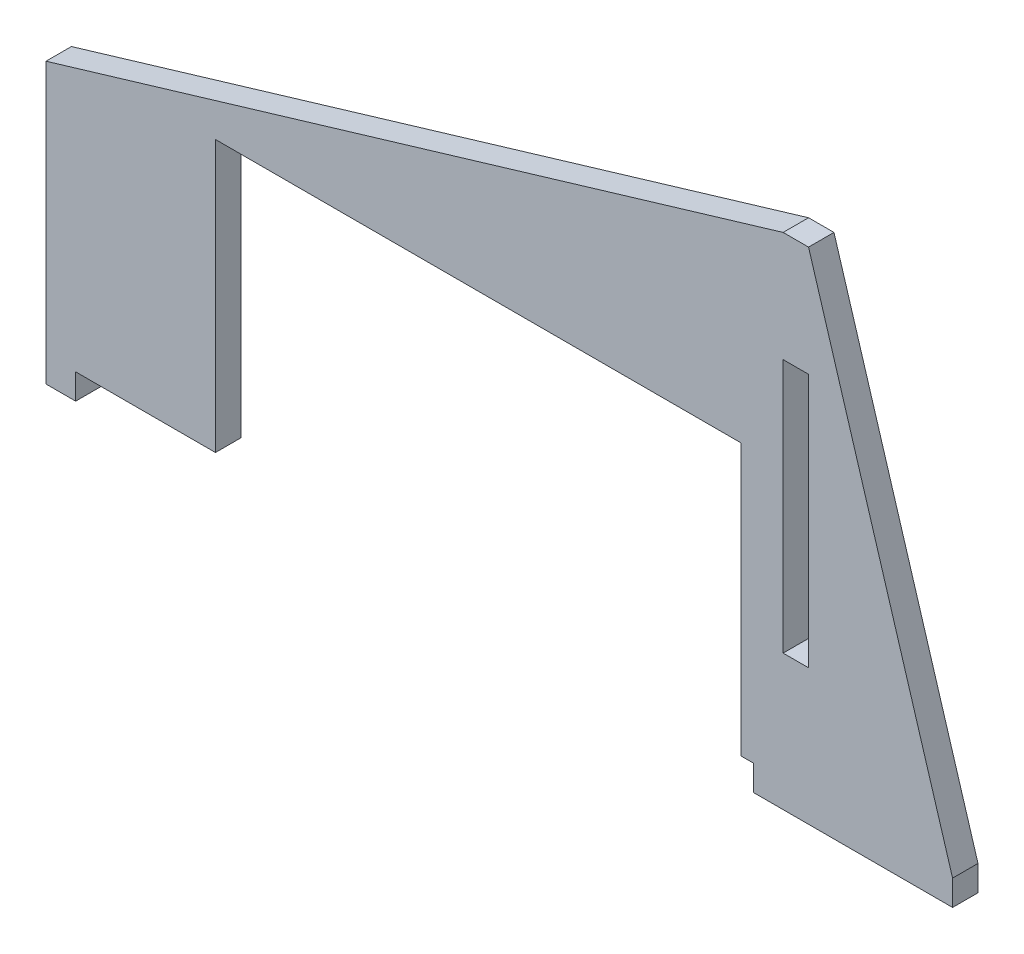
ISO-10303-21;
HEADER;
FILE_DESCRIPTION(('STEP AP214'),'2;1');
FILE_NAME('part.step','',(''),(''),'','','');
FILE_SCHEMA(('AUTOMOTIVE_DESIGN { 1 0 10303 214 1 1 1 1 }'));
ENDSEC;
DATA;
#1=APPLICATION_CONTEXT('core data for automotive mechanical design processes');
#2=APPLICATION_PROTOCOL_DEFINITION('international standard','automotive_design',2000,#1);
#3=PRODUCT_CONTEXT('',#1,'mechanical');
#4=PRODUCT('Part','Part','',(#3));
#5=PRODUCT_RELATED_PRODUCT_CATEGORY('part','',(#4));
#6=PRODUCT_DEFINITION_FORMATION('','',#4);
#7=PRODUCT_DEFINITION_CONTEXT('part definition',#1,'design');
#8=PRODUCT_DEFINITION('design','',#6,#7);
#9=PRODUCT_DEFINITION_SHAPE('','',#8);
#10=(LENGTH_UNIT() NAMED_UNIT(*) SI_UNIT(.MILLI.,.METRE.));
#11=(NAMED_UNIT(*) PLANE_ANGLE_UNIT() SI_UNIT($,.RADIAN.));
#12=(NAMED_UNIT(*) SI_UNIT($,.STERADIAN.) SOLID_ANGLE_UNIT());
#13=UNCERTAINTY_MEASURE_WITH_UNIT(LENGTH_MEASURE(1.E-05),#10,'distance_accuracy_value','');
#14=(GEOMETRIC_REPRESENTATION_CONTEXT(3) GLOBAL_UNCERTAINTY_ASSIGNED_CONTEXT((#13)) GLOBAL_UNIT_ASSIGNED_CONTEXT((#10,
#11,#12)) REPRESENTATION_CONTEXT('',''));
#15=CARTESIAN_POINT('',(0.,0.,0.));
#16=DIRECTION('',(0.,0.,1.));
#17=DIRECTION('',(1.,0.,0.));
#18=AXIS2_PLACEMENT_3D('',#15,#16,#17);
#19=CARTESIAN_POINT('',(0.,0.,3.));
#20=DIRECTION('',(0.,0.,-1.));
#21=DIRECTION('',(-1.,0.,0.));
#22=AXIS2_PLACEMENT_3D('',#19,#20,#21);
#23=PLANE('',#22);
#24=DIRECTION('',(0.,-1.,0.));
#25=VECTOR('',#24,1.);
#26=CARTESIAN_POINT('',(-90.,33.,3.));
#27=LINE('',#26,#25);
#28=CARTESIAN_POINT('',(-90.,33.,3.));
#29=VERTEX_POINT('',#28);
#30=CARTESIAN_POINT('',(-90.,0.,3.));
#31=VERTEX_POINT('',#30);
#32=EDGE_CURVE('E194',#29,#31,#27,.T.);
#33=ORIENTED_EDGE('',*,*,#32,.T.);
#34=DIRECTION('',(1.,-1.16063243671944E-11,0.));
#35=VECTOR('',#34,1.);
#36=CARTESIAN_POINT('',(-90.,0.,3.));
#37=LINE('',#36,#35);
#38=CARTESIAN_POINT('',(-86.5,-4.06256047321326E-11,3.));
#39=VERTEX_POINT('',#38);
#40=EDGE_CURVE('E197',#31,#39,#37,.T.);
#41=ORIENTED_EDGE('',*,*,#40,.T.);
#42=DIRECTION('',(0.,1.,0.));
#43=VECTOR('',#42,1.);
#44=CARTESIAN_POINT('',(-86.5,2.99999999995937,3.));
#45=LINE('',#44,#43);
#46=CARTESIAN_POINT('',(-86.5,2.99999999995937,3.));
#47=VERTEX_POINT('',#46);
#48=EDGE_CURVE('E200',#39,#47,#45,.T.);
#49=ORIENTED_EDGE('',*,*,#48,.T.);
#50=DIRECTION('',(1.,0.,0.));
#51=VECTOR('',#50,1.);
#52=CARTESIAN_POINT('',(-70.,2.99999999995942,3.));
#53=LINE('',#52,#51);
#54=CARTESIAN_POINT('',(-70.,2.99999999995942,3.));
#55=VERTEX_POINT('',#54);
#56=EDGE_CURVE('E202',#47,#55,#53,.T.);
#57=ORIENTED_EDGE('',*,*,#56,.T.);
#58=DIRECTION('',(0.,1.,0.));
#59=VECTOR('',#58,1.);
#60=CARTESIAN_POINT('',(-70.,2.99999999995942,3.));
#61=LINE('',#60,#59);
#62=CARTESIAN_POINT('',(-70.,34.9999999999594,3.));
#63=VERTEX_POINT('',#62);
#64=EDGE_CURVE('E204',#55,#63,#61,.T.);
#65=ORIENTED_EDGE('',*,*,#64,.T.);
#66=DIRECTION('',(1.,0.,0.));
#67=VECTOR('',#66,1.);
#68=CARTESIAN_POINT('',(-70.,34.9999999999594,3.));
#69=LINE('',#68,#67);
#70=CARTESIAN_POINT('',(-7.99999999999996,34.9999999999594,3.));
#71=VERTEX_POINT('',#70);
#72=EDGE_CURVE('E206',#63,#71,#69,.T.);
#73=ORIENTED_EDGE('',*,*,#72,.T.);
#74=DIRECTION('',(0.,-1.,0.));
#75=VECTOR('',#74,1.);
#76=CARTESIAN_POINT('',(-7.99999999999996,2.99999999995956,3.));
#77=LINE('',#76,#75);
#78=CARTESIAN_POINT('',(-7.99999999999996,2.99999999995956,3.));
#79=VERTEX_POINT('',#78);
#80=EDGE_CURVE('E208',#71,#79,#77,.T.);
#81=ORIENTED_EDGE('',*,*,#80,.T.);
#82=DIRECTION('',(1.,0.,0.));
#83=VECTOR('',#82,1.);
#84=CARTESIAN_POINT('',(-6.49999999999997,2.99999999995956,3.));
#85=LINE('',#84,#83);
#86=CARTESIAN_POINT('',(-6.49999999999997,2.99999999995956,3.));
#87=VERTEX_POINT('',#86);
#88=EDGE_CURVE('E210',#79,#87,#85,.T.);
#89=ORIENTED_EDGE('',*,*,#88,.T.);
#90=DIRECTION('',(0.,-1.,0.));
#91=VECTOR('',#90,1.);
#92=CARTESIAN_POINT('',(-6.49999999999996,-4.04405675613617E-11,3.));
#93=LINE('',#92,#91);
#94=CARTESIAN_POINT('',(-6.49999999999996,-4.04405675613617E-11,3.));
#95=VERTEX_POINT('',#94);
#96=EDGE_CURVE('E212',#87,#95,#93,.T.);
#97=ORIENTED_EDGE('',*,*,#96,.T.);
#98=DIRECTION('',(1.,1.7208752153771E-12,0.));
#99=VECTOR('',#98,1.);
#100=CARTESIAN_POINT('',(-6.49999999999996,-4.04405675613617E-11,3.));
#101=LINE('',#100,#99);
#102=CARTESIAN_POINT('',(17.,0.,3.));
#103=VERTEX_POINT('',#102);
#104=EDGE_CURVE('E214',#95,#103,#101,.T.);
#105=ORIENTED_EDGE('',*,*,#104,.T.);
#106=DIRECTION('',(0.,1.,0.));
#107=VECTOR('',#106,1.);
#108=CARTESIAN_POINT('',(17.,0.,3.));
#109=LINE('',#108,#107);
#110=CARTESIAN_POINT('',(17.,3.,3.));
#111=VERTEX_POINT('',#110);
#112=EDGE_CURVE('E216',#103,#111,#109,.T.);
#113=ORIENTED_EDGE('',*,*,#112,.T.);
#114=DIRECTION('',(-0.290481603623537,0.956880576642821,0.));
#115=VECTOR('',#114,1.);
#116=CARTESIAN_POINT('',(17.,3.,3.));
#117=LINE('',#116,#115);
#118=CARTESIAN_POINT('',(0.,59.000000000034,3.));
#119=VERTEX_POINT('',#118);
#120=EDGE_CURVE('E218',#111,#119,#117,.T.);
#121=ORIENTED_EDGE('',*,*,#120,.T.);
#122=DIRECTION('',(-1.,0.,0.));
#123=VECTOR('',#122,1.);
#124=CARTESIAN_POINT('',(0.,59.000000000034,3.));
#125=LINE('',#124,#123);
#126=CARTESIAN_POINT('',(-3.,59.000000000034,3.));
#127=VERTEX_POINT('',#126);
#128=EDGE_CURVE('E220',#119,#127,#125,.T.);
#129=ORIENTED_EDGE('',*,*,#128,.T.);
#130=DIRECTION('',(-0.958128861743707,-0.286337360981252,0.));
#131=VECTOR('',#130,1.);
#132=CARTESIAN_POINT('',(-3.,59.000000000034,3.));
#133=LINE('',#132,#131);
#134=EDGE_CURVE('E222',#127,#29,#133,.T.);
#135=ORIENTED_EDGE('',*,*,#134,.T.);
#136=EDGE_LOOP('',(#33,#41,#49,#57,#65,#73,#81,#89,#97,#105,#113,#121,#129,#135));
#137=FACE_BOUND('',#136,.T.);
#138=DIRECTION('',(-1.,0.,0.));
#139=VECTOR('',#138,1.);
#140=CARTESIAN_POINT('',(0.,45.9999999999955,3.));
#141=LINE('',#140,#139);
#142=CARTESIAN_POINT('',(0.,45.9999999999955,3.));
#143=VERTEX_POINT('',#142);
#144=CARTESIAN_POINT('',(-3.,45.9999999999955,3.));
#145=VERTEX_POINT('',#144);
#146=EDGE_CURVE('E158',#143,#145,#141,.T.);
#147=ORIENTED_EDGE('',*,*,#146,.F.);
#148=DIRECTION('',(0.,1.,0.));
#149=VECTOR('',#148,1.);
#150=CARTESIAN_POINT('',(0.,15.9999999999955,3.));
#151=LINE('',#150,#149);
#152=CARTESIAN_POINT('',(0.,15.9999999999955,3.));
#153=VERTEX_POINT('',#152);
#154=EDGE_CURVE('E180',#153,#143,#151,.T.);
#155=ORIENTED_EDGE('',*,*,#154,.F.);
#156=DIRECTION('',(1.,0.,0.));
#157=VECTOR('',#156,1.);
#158=CARTESIAN_POINT('',(-3.,15.9999999999955,3.));
#159=LINE('',#158,#157);
#160=CARTESIAN_POINT('',(-3.,15.9999999999955,3.));
#161=VERTEX_POINT('',#160);
#162=EDGE_CURVE('E178',#161,#153,#159,.T.);
#163=ORIENTED_EDGE('',*,*,#162,.F.);
#164=DIRECTION('',(0.,-1.,0.));
#165=VECTOR('',#164,1.);
#166=CARTESIAN_POINT('',(-3.,45.9999999999955,3.));
#167=LINE('',#166,#165);
#168=EDGE_CURVE('E166',#145,#161,#167,.T.);
#169=ORIENTED_EDGE('',*,*,#168,.F.);
#170=EDGE_LOOP('',(#147,#155,#163,#169));
#171=FACE_BOUND('',#170,.T.);
#172=ADVANCED_FACE('F33',(#137,#171),#23,.F.);
#173=CARTESIAN_POINT('',(0.,0.,0.));
#174=DIRECTION('',(0.,0.,-1.));
#175=DIRECTION('',(-1.,0.,0.));
#176=AXIS2_PLACEMENT_3D('',#173,#174,#175);
#177=PLANE('',#176);
#178=DIRECTION('',(0.,-1.,0.));
#179=VECTOR('',#178,1.);
#180=CARTESIAN_POINT('',(-90.,33.,0.));
#181=LINE('',#180,#179);
#182=CARTESIAN_POINT('',(-90.,33.,0.));
#183=VERTEX_POINT('',#182);
#184=CARTESIAN_POINT('',(-90.,0.,0.));
#185=VERTEX_POINT('',#184);
#186=EDGE_CURVE('E174',#183,#185,#181,.T.);
#187=ORIENTED_EDGE('',*,*,#186,.F.);
#188=DIRECTION('',(-0.958128861743707,-0.286337360981252,0.));
#189=VECTOR('',#188,1.);
#190=CARTESIAN_POINT('',(-3.,59.000000000034,0.));
#191=LINE('',#190,#189);
#192=CARTESIAN_POINT('',(-3.,59.000000000034,0.));
#193=VERTEX_POINT('',#192);
#194=EDGE_CURVE('E198',#193,#183,#191,.T.);
#195=ORIENTED_EDGE('',*,*,#194,.F.);
#196=DIRECTION('',(-1.,0.,0.));
#197=VECTOR('',#196,1.);
#198=CARTESIAN_POINT('',(0.,59.000000000034,0.));
#199=LINE('',#198,#197);
#200=CARTESIAN_POINT('',(0.,59.000000000034,0.));
#201=VERTEX_POINT('',#200);
#202=EDGE_CURVE('E249',#201,#193,#199,.T.);
#203=ORIENTED_EDGE('',*,*,#202,.F.);
#204=DIRECTION('',(-0.290481603623537,0.956880576642821,0.));
#205=VECTOR('',#204,1.);
#206=CARTESIAN_POINT('',(17.,3.,0.));
#207=LINE('',#206,#205);
#208=CARTESIAN_POINT('',(17.,3.,0.));
#209=VERTEX_POINT('',#208);
#210=EDGE_CURVE('E247',#209,#201,#207,.T.);
#211=ORIENTED_EDGE('',*,*,#210,.F.);
#212=DIRECTION('',(0.,1.,0.));
#213=VECTOR('',#212,1.);
#214=CARTESIAN_POINT('',(17.,0.,0.));
#215=LINE('',#214,#213);
#216=CARTESIAN_POINT('',(17.,0.,0.));
#217=VERTEX_POINT('',#216);
#218=EDGE_CURVE('E245',#217,#209,#215,.T.);
#219=ORIENTED_EDGE('',*,*,#218,.F.);
#220=DIRECTION('',(1.,1.7208752153771E-12,0.));
#221=VECTOR('',#220,1.);
#222=CARTESIAN_POINT('',(-6.49999999999996,-4.04405675613617E-11,0.));
#223=LINE('',#222,#221);
#224=CARTESIAN_POINT('',(-6.49999999999996,-4.04405675613617E-11,0.));
#225=VERTEX_POINT('',#224);
#226=EDGE_CURVE('E243',#225,#217,#223,.T.);
#227=ORIENTED_EDGE('',*,*,#226,.F.);
#228=DIRECTION('',(0.,-1.,0.));
#229=VECTOR('',#228,1.);
#230=CARTESIAN_POINT('',(-6.49999999999996,-4.04405675613617E-11,0.));
#231=LINE('',#230,#229);
#232=CARTESIAN_POINT('',(-6.49999999999997,2.99999999995956,0.));
#233=VERTEX_POINT('',#232);
#234=EDGE_CURVE('E241',#233,#225,#231,.T.);
#235=ORIENTED_EDGE('',*,*,#234,.F.);
#236=DIRECTION('',(1.,0.,0.));
#237=VECTOR('',#236,1.);
#238=CARTESIAN_POINT('',(-6.49999999999997,2.99999999995956,0.));
#239=LINE('',#238,#237);
#240=CARTESIAN_POINT('',(-7.99999999999996,2.99999999995956,0.));
#241=VERTEX_POINT('',#240);
#242=EDGE_CURVE('E239',#241,#233,#239,.T.);
#243=ORIENTED_EDGE('',*,*,#242,.F.);
#244=DIRECTION('',(0.,-1.,0.));
#245=VECTOR('',#244,1.);
#246=CARTESIAN_POINT('',(-7.99999999999996,2.99999999995956,0.));
#247=LINE('',#246,#245);
#248=CARTESIAN_POINT('',(-7.99999999999996,34.9999999999594,0.));
#249=VERTEX_POINT('',#248);
#250=EDGE_CURVE('E237',#249,#241,#247,.T.);
#251=ORIENTED_EDGE('',*,*,#250,.F.);
#252=DIRECTION('',(1.,0.,0.));
#253=VECTOR('',#252,1.);
#254=CARTESIAN_POINT('',(-70.,34.9999999999594,0.));
#255=LINE('',#254,#253);
#256=CARTESIAN_POINT('',(-70.,34.9999999999594,0.));
#257=VERTEX_POINT('',#256);
#258=EDGE_CURVE('E235',#257,#249,#255,.T.);
#259=ORIENTED_EDGE('',*,*,#258,.F.);
#260=DIRECTION('',(0.,1.,0.));
#261=VECTOR('',#260,1.);
#262=CARTESIAN_POINT('',(-70.,2.99999999995942,0.));
#263=LINE('',#262,#261);
#264=CARTESIAN_POINT('',(-70.,2.99999999995942,0.));
#265=VERTEX_POINT('',#264);
#266=EDGE_CURVE('E233',#265,#257,#263,.T.);
#267=ORIENTED_EDGE('',*,*,#266,.F.);
#268=DIRECTION('',(1.,0.,0.));
#269=VECTOR('',#268,1.);
#270=CARTESIAN_POINT('',(-70.,2.99999999995942,0.));
#271=LINE('',#270,#269);
#272=CARTESIAN_POINT('',(-86.5,2.99999999995937,0.));
#273=VERTEX_POINT('',#272);
#274=EDGE_CURVE('E231',#273,#265,#271,.T.);
#275=ORIENTED_EDGE('',*,*,#274,.F.);
#276=DIRECTION('',(0.,1.,0.));
#277=VECTOR('',#276,1.);
#278=CARTESIAN_POINT('',(-86.5,2.99999999995937,0.));
#279=LINE('',#278,#277);
#280=CARTESIAN_POINT('',(-86.5,-4.06256047321326E-11,0.));
#281=VERTEX_POINT('',#280);
#282=EDGE_CURVE('E229',#281,#273,#279,.T.);
#283=ORIENTED_EDGE('',*,*,#282,.F.);
#284=DIRECTION('',(1.,-1.16063243671944E-11,0.));
#285=VECTOR('',#284,1.);
#286=CARTESIAN_POINT('',(-90.,0.,0.));
#287=LINE('',#286,#285);
#288=EDGE_CURVE('E227',#185,#281,#287,.T.);
#289=ORIENTED_EDGE('',*,*,#288,.F.);
#290=EDGE_LOOP('',(#187,#195,#203,#211,#219,#227,#235,#243,#251,#259,#267,#275,#283,#289));
#291=FACE_BOUND('',#290,.T.);
#292=DIRECTION('',(0.,1.,0.));
#293=VECTOR('',#292,1.);
#294=CARTESIAN_POINT('',(0.,15.9999999999955,0.));
#295=LINE('',#294,#293);
#296=CARTESIAN_POINT('',(0.,15.9999999999955,0.));
#297=VERTEX_POINT('',#296);
#298=CARTESIAN_POINT('',(0.,45.9999999999955,0.));
#299=VERTEX_POINT('',#298);
#300=EDGE_CURVE('E167',#297,#299,#295,.T.);
#301=ORIENTED_EDGE('',*,*,#300,.T.);
#302=DIRECTION('',(-1.,0.,0.));
#303=VECTOR('',#302,1.);
#304=CARTESIAN_POINT('',(0.,45.9999999999955,0.));
#305=LINE('',#304,#303);
#306=CARTESIAN_POINT('',(-3.,45.9999999999955,0.));
#307=VERTEX_POINT('',#306);
#308=EDGE_CURVE('E56',#299,#307,#305,.T.);
#309=ORIENTED_EDGE('',*,*,#308,.T.);
#310=DIRECTION('',(0.,-1.,0.));
#311=VECTOR('',#310,1.);
#312=CARTESIAN_POINT('',(-3.,45.9999999999955,0.));
#313=LINE('',#312,#311);
#314=CARTESIAN_POINT('',(-3.,15.9999999999955,0.));
#315=VERTEX_POINT('',#314);
#316=EDGE_CURVE('E173',#307,#315,#313,.T.);
#317=ORIENTED_EDGE('',*,*,#316,.T.);
#318=DIRECTION('',(1.,0.,0.));
#319=VECTOR('',#318,1.);
#320=CARTESIAN_POINT('',(-3.,15.9999999999955,0.));
#321=LINE('',#320,#319);
#322=EDGE_CURVE('E186',#315,#297,#321,.T.);
#323=ORIENTED_EDGE('',*,*,#322,.T.);
#324=EDGE_LOOP('',(#301,#309,#317,#323));
#325=FACE_BOUND('',#324,.T.);
#326=ADVANCED_FACE('F297',(#291,#325),#177,.T.);
#327=CARTESIAN_POINT('',(-90.,33.,3.));
#328=DIRECTION('',(1.,0.,0.));
#329=DIRECTION('',(0.,1.,0.));
#330=AXIS2_PLACEMENT_3D('',#327,#328,#329);
#331=PLANE('',#330);
#332=ORIENTED_EDGE('',*,*,#186,.T.);
#333=DIRECTION('',(0.,0.,-1.));
#334=VECTOR('',#333,1.);
#335=CARTESIAN_POINT('',(-90.,0.,3.));
#336=LINE('',#335,#334);
#337=EDGE_CURVE('E11',#31,#185,#336,.T.);
#338=ORIENTED_EDGE('',*,*,#337,.F.);
#339=ORIENTED_EDGE('',*,*,#32,.F.);
#340=DIRECTION('',(0.,0.,-1.));
#341=VECTOR('',#340,1.);
#342=CARTESIAN_POINT('',(-90.,33.,3.));
#343=LINE('',#342,#341);
#344=EDGE_CURVE('E224',#29,#183,#343,.T.);
#345=ORIENTED_EDGE('',*,*,#344,.T.);
#346=EDGE_LOOP('',(#332,#338,#339,#345));
#347=FACE_BOUND('',#346,.T.);
#348=ADVANCED_FACE('F35',(#347),#331,.F.);
#349=CARTESIAN_POINT('',(-90.,0.,3.));
#350=DIRECTION('',(1.16063243671944E-11,1.,0.));
#351=DIRECTION('',(-1.,1.16063243671944E-11,0.));
#352=AXIS2_PLACEMENT_3D('',#349,#350,#351);
#353=PLANE('',#352);
#354=ORIENTED_EDGE('',*,*,#288,.T.);
#355=DIRECTION('',(0.,0.,-1.));
#356=VECTOR('',#355,1.);
#357=CARTESIAN_POINT('',(-86.5,-4.06256047321326E-11,3.));
#358=LINE('',#357,#356);
#359=EDGE_CURVE('E41',#39,#281,#358,.T.);
#360=ORIENTED_EDGE('',*,*,#359,.F.);
#361=ORIENTED_EDGE('',*,*,#40,.F.);
#362=ORIENTED_EDGE('',*,*,#337,.T.);
#363=EDGE_LOOP('',(#354,#360,#361,#362));
#364=FACE_BOUND('',#363,.T.);
#365=ADVANCED_FACE('F314',(#364),#353,.F.);
#366=CARTESIAN_POINT('',(-86.5,2.99999999995937,3.));
#367=DIRECTION('',(-1.,0.,0.));
#368=DIRECTION('',(0.,0.,1.));
#369=AXIS2_PLACEMENT_3D('',#366,#367,#368);
#370=PLANE('',#369);
#371=ORIENTED_EDGE('',*,*,#282,.T.);
#372=DIRECTION('',(0.,0.,-1.));
#373=VECTOR('',#372,1.);
#374=CARTESIAN_POINT('',(-86.5,2.99999999995937,3.));
#375=LINE('',#374,#373);
#376=EDGE_CURVE('E284',#47,#273,#375,.T.);
#377=ORIENTED_EDGE('',*,*,#376,.F.);
#378=ORIENTED_EDGE('',*,*,#48,.F.);
#379=ORIENTED_EDGE('',*,*,#359,.T.);
#380=EDGE_LOOP('',(#371,#377,#378,#379));
#381=FACE_BOUND('',#380,.T.);
#382=ADVANCED_FACE('F291',(#381),#370,.F.);
#383=CARTESIAN_POINT('',(-70.,2.99999999995942,3.));
#384=DIRECTION('',(0.,1.,0.));
#385=DIRECTION('',(-1.,0.,0.));
#386=AXIS2_PLACEMENT_3D('',#383,#384,#385);
#387=PLANE('',#386);
#388=ORIENTED_EDGE('',*,*,#274,.T.);
#389=DIRECTION('',(0.,0.,-1.));
#390=VECTOR('',#389,1.);
#391=CARTESIAN_POINT('',(-70.,2.99999999995942,3.));
#392=LINE('',#391,#390);
#393=EDGE_CURVE('E281',#55,#265,#392,.T.);
#394=ORIENTED_EDGE('',*,*,#393,.F.);
#395=ORIENTED_EDGE('',*,*,#56,.F.);
#396=ORIENTED_EDGE('',*,*,#376,.T.);
#397=EDGE_LOOP('',(#388,#394,#395,#396));
#398=FACE_BOUND('',#397,.T.);
#399=ADVANCED_FACE('F303',(#398),#387,.F.);
#400=CARTESIAN_POINT('',(-70.,2.99999999995942,3.));
#401=DIRECTION('',(-1.,0.,0.));
#402=DIRECTION('',(0.,-1.,0.));
#403=AXIS2_PLACEMENT_3D('',#400,#401,#402);
#404=PLANE('',#403);
#405=ORIENTED_EDGE('',*,*,#266,.T.);
#406=DIRECTION('',(0.,0.,-1.));
#407=VECTOR('',#406,1.);
#408=CARTESIAN_POINT('',(-70.,34.9999999999594,3.));
#409=LINE('',#408,#407);
#410=EDGE_CURVE('E278',#63,#257,#409,.T.);
#411=ORIENTED_EDGE('',*,*,#410,.F.);
#412=ORIENTED_EDGE('',*,*,#64,.F.);
#413=ORIENTED_EDGE('',*,*,#393,.T.);
#414=EDGE_LOOP('',(#405,#411,#412,#413));
#415=FACE_BOUND('',#414,.T.);
#416=ADVANCED_FACE('F307',(#415),#404,.F.);
#417=CARTESIAN_POINT('',(-70.,34.9999999999594,3.));
#418=DIRECTION('',(0.,1.,0.));
#419=DIRECTION('',(-1.,0.,0.));
#420=AXIS2_PLACEMENT_3D('',#417,#418,#419);
#421=PLANE('',#420);
#422=ORIENTED_EDGE('',*,*,#258,.T.);
#423=DIRECTION('',(0.,0.,-1.));
#424=VECTOR('',#423,1.);
#425=CARTESIAN_POINT('',(-7.99999999999996,34.9999999999594,3.));
#426=LINE('',#425,#424);
#427=EDGE_CURVE('E275',#71,#249,#426,.T.);
#428=ORIENTED_EDGE('',*,*,#427,.F.);
#429=ORIENTED_EDGE('',*,*,#72,.F.);
#430=ORIENTED_EDGE('',*,*,#410,.T.);
#431=EDGE_LOOP('',(#422,#428,#429,#430));
#432=FACE_BOUND('',#431,.T.);
#433=ADVANCED_FACE('F357',(#432),#421,.F.);
#434=CARTESIAN_POINT('',(-7.99999999999996,2.99999999995956,3.));
#435=DIRECTION('',(1.,0.,0.));
#436=DIRECTION('',(0.,0.,-1.));
#437=AXIS2_PLACEMENT_3D('',#434,#435,#436);
#438=PLANE('',#437);
#439=ORIENTED_EDGE('',*,*,#250,.T.);
#440=DIRECTION('',(0.,0.,-1.));
#441=VECTOR('',#440,1.);
#442=CARTESIAN_POINT('',(-7.99999999999996,2.99999999995956,3.));
#443=LINE('',#442,#441);
#444=EDGE_CURVE('E272',#79,#241,#443,.T.);
#445=ORIENTED_EDGE('',*,*,#444,.F.);
#446=ORIENTED_EDGE('',*,*,#80,.F.);
#447=ORIENTED_EDGE('',*,*,#427,.T.);
#448=EDGE_LOOP('',(#439,#445,#446,#447));
#449=FACE_BOUND('',#448,.T.);
#450=ADVANCED_FACE('F355',(#449),#438,.F.);
#451=CARTESIAN_POINT('',(-6.49999999999997,2.99999999995956,3.));
#452=DIRECTION('',(0.,1.,0.));
#453=DIRECTION('',(0.,0.,1.));
#454=AXIS2_PLACEMENT_3D('',#451,#452,#453);
#455=PLANE('',#454);
#456=ORIENTED_EDGE('',*,*,#242,.T.);
#457=DIRECTION('',(0.,0.,-1.));
#458=VECTOR('',#457,1.);
#459=CARTESIAN_POINT('',(-6.49999999999997,2.99999999995956,3.));
#460=LINE('',#459,#458);
#461=EDGE_CURVE('E269',#87,#233,#460,.T.);
#462=ORIENTED_EDGE('',*,*,#461,.F.);
#463=ORIENTED_EDGE('',*,*,#88,.F.);
#464=ORIENTED_EDGE('',*,*,#444,.T.);
#465=EDGE_LOOP('',(#456,#462,#463,#464));
#466=FACE_BOUND('',#465,.T.);
#467=ADVANCED_FACE('F350',(#466),#455,.F.);
#468=CARTESIAN_POINT('',(-6.49999999999996,-4.04405675613617E-11,3.));
#469=DIRECTION('',(1.,0.,0.));
#470=DIRECTION('',(0.,1.,0.));
#471=AXIS2_PLACEMENT_3D('',#468,#469,#470);
#472=PLANE('',#471);
#473=ORIENTED_EDGE('',*,*,#234,.T.);
#474=DIRECTION('',(0.,0.,-1.));
#475=VECTOR('',#474,1.);
#476=CARTESIAN_POINT('',(-6.49999999999996,-4.04405675613617E-11,3.));
#477=LINE('',#476,#475);
#478=EDGE_CURVE('E266',#95,#225,#477,.T.);
#479=ORIENTED_EDGE('',*,*,#478,.F.);
#480=ORIENTED_EDGE('',*,*,#96,.F.);
#481=ORIENTED_EDGE('',*,*,#461,.T.);
#482=EDGE_LOOP('',(#473,#479,#480,#481));
#483=FACE_BOUND('',#482,.T.);
#484=ADVANCED_FACE('F345',(#483),#472,.F.);
#485=CARTESIAN_POINT('',(-6.49999999999996,-4.04405675613617E-11,3.));
#486=DIRECTION('',(-1.7208752153771E-12,1.,0.));
#487=DIRECTION('',(-1.,-1.7208752153771E-12,0.));
#488=AXIS2_PLACEMENT_3D('',#485,#486,#487);
#489=PLANE('',#488);
#490=ORIENTED_EDGE('',*,*,#226,.T.);
#491=DIRECTION('',(0.,0.,-1.));
#492=VECTOR('',#491,1.);
#493=CARTESIAN_POINT('',(17.,0.,3.));
#494=LINE('',#493,#492);
#495=EDGE_CURVE('E263',#103,#217,#494,.T.);
#496=ORIENTED_EDGE('',*,*,#495,.F.);
#497=ORIENTED_EDGE('',*,*,#104,.F.);
#498=ORIENTED_EDGE('',*,*,#478,.T.);
#499=EDGE_LOOP('',(#490,#496,#497,#498));
#500=FACE_BOUND('',#499,.T.);
#501=ADVANCED_FACE('F341',(#500),#489,.F.);
#502=CARTESIAN_POINT('',(17.,0.,3.));
#503=DIRECTION('',(-1.,0.,0.));
#504=DIRECTION('',(0.,-1.,0.));
#505=AXIS2_PLACEMENT_3D('',#502,#503,#504);
#506=PLANE('',#505);
#507=ORIENTED_EDGE('',*,*,#218,.T.);
#508=DIRECTION('',(0.,0.,-1.));
#509=VECTOR('',#508,1.);
#510=CARTESIAN_POINT('',(17.,3.,3.));
#511=LINE('',#510,#509);
#512=EDGE_CURVE('E260',#111,#209,#511,.T.);
#513=ORIENTED_EDGE('',*,*,#512,.F.);
#514=ORIENTED_EDGE('',*,*,#112,.F.);
#515=ORIENTED_EDGE('',*,*,#495,.T.);
#516=EDGE_LOOP('',(#507,#513,#514,#515));
#517=FACE_BOUND('',#516,.T.);
#518=ADVANCED_FACE('F336',(#517),#506,.F.);
#519=CARTESIAN_POINT('',(17.,3.,3.));
#520=DIRECTION('',(-0.956880576642821,-0.290481603623537,0.));
#521=DIRECTION('',(0.290481603623537,-0.956880576642821,0.));
#522=AXIS2_PLACEMENT_3D('',#519,#520,#521);
#523=PLANE('',#522);
#524=ORIENTED_EDGE('',*,*,#210,.T.);
#525=DIRECTION('',(0.,0.,-1.));
#526=VECTOR('',#525,1.);
#527=CARTESIAN_POINT('',(0.,59.000000000034,3.));
#528=LINE('',#527,#526);
#529=EDGE_CURVE('E257',#119,#201,#528,.T.);
#530=ORIENTED_EDGE('',*,*,#529,.F.);
#531=ORIENTED_EDGE('',*,*,#120,.F.);
#532=ORIENTED_EDGE('',*,*,#512,.T.);
#533=EDGE_LOOP('',(#524,#530,#531,#532));
#534=FACE_BOUND('',#533,.T.);
#535=ADVANCED_FACE('F330',(#534),#523,.F.);
#536=CARTESIAN_POINT('',(0.,59.000000000034,3.));
#537=DIRECTION('',(0.,-1.,0.));
#538=DIRECTION('',(0.,0.,-1.));
#539=AXIS2_PLACEMENT_3D('',#536,#537,#538);
#540=PLANE('',#539);
#541=ORIENTED_EDGE('',*,*,#202,.T.);
#542=DIRECTION('',(0.,0.,-1.));
#543=VECTOR('',#542,1.);
#544=CARTESIAN_POINT('',(-3.,59.000000000034,3.));
#545=LINE('',#544,#543);
#546=EDGE_CURVE('E254',#127,#193,#545,.T.);
#547=ORIENTED_EDGE('',*,*,#546,.F.);
#548=ORIENTED_EDGE('',*,*,#128,.F.);
#549=ORIENTED_EDGE('',*,*,#529,.T.);
#550=EDGE_LOOP('',(#541,#547,#548,#549));
#551=FACE_BOUND('',#550,.T.);
#552=ADVANCED_FACE('F326',(#551),#540,.F.);
#553=CARTESIAN_POINT('',(-3.,59.000000000034,3.));
#554=DIRECTION('',(0.286337360981252,-0.958128861743707,0.));
#555=DIRECTION('',(0.958128861743707,0.286337360981252,0.));
#556=AXIS2_PLACEMENT_3D('',#553,#554,#555);
#557=PLANE('',#556);
#558=ORIENTED_EDGE('',*,*,#194,.T.);
#559=ORIENTED_EDGE('',*,*,#344,.F.);
#560=ORIENTED_EDGE('',*,*,#134,.F.);
#561=ORIENTED_EDGE('',*,*,#546,.T.);
#562=EDGE_LOOP('',(#558,#559,#560,#561));
#563=FACE_BOUND('',#562,.T.);
#564=ADVANCED_FACE('F321',(#563),#557,.F.);
#565=CARTESIAN_POINT('',(0.,45.9999999999955,3.));
#566=DIRECTION('',(0.,-1.,0.));
#567=DIRECTION('',(1.,0.,0.));
#568=AXIS2_PLACEMENT_3D('',#565,#566,#567);
#569=PLANE('',#568);
#570=ORIENTED_EDGE('',*,*,#308,.F.);
#571=DIRECTION('',(0.,0.,-1.));
#572=VECTOR('',#571,1.);
#573=CARTESIAN_POINT('',(0.,45.9999999999955,3.));
#574=LINE('',#573,#572);
#575=EDGE_CURVE('E162',#143,#299,#574,.T.);
#576=ORIENTED_EDGE('',*,*,#575,.F.);
#577=ORIENTED_EDGE('',*,*,#146,.T.);
#578=DIRECTION('',(0.,0.,-1.));
#579=VECTOR('',#578,1.);
#580=CARTESIAN_POINT('',(-3.,45.9999999999955,3.));
#581=LINE('',#580,#579);
#582=EDGE_CURVE('E161',#145,#307,#581,.T.);
#583=ORIENTED_EDGE('',*,*,#582,.T.);
#584=EDGE_LOOP('',(#570,#576,#577,#583));
#585=FACE_BOUND('',#584,.T.);
#586=ADVANCED_FACE('F160',(#585),#569,.T.);
#587=CARTESIAN_POINT('',(-3.,45.9999999999955,3.));
#588=DIRECTION('',(1.,0.,0.));
#589=DIRECTION('',(0.,0.,-1.));
#590=AXIS2_PLACEMENT_3D('',#587,#588,#589);
#591=PLANE('',#590);
#592=ORIENTED_EDGE('',*,*,#316,.F.);
#593=ORIENTED_EDGE('',*,*,#582,.F.);
#594=ORIENTED_EDGE('',*,*,#168,.T.);
#595=DIRECTION('',(0.,0.,-1.));
#596=VECTOR('',#595,1.);
#597=CARTESIAN_POINT('',(-3.,15.9999999999955,3.));
#598=LINE('',#597,#596);
#599=EDGE_CURVE('E175',#161,#315,#598,.T.);
#600=ORIENTED_EDGE('',*,*,#599,.T.);
#601=EDGE_LOOP('',(#592,#593,#594,#600));
#602=FACE_BOUND('',#601,.T.);
#603=ADVANCED_FACE('F170',(#602),#591,.T.);
#604=CARTESIAN_POINT('',(-3.,15.9999999999955,3.));
#605=DIRECTION('',(0.,1.,0.));
#606=DIRECTION('',(0.,0.,1.));
#607=AXIS2_PLACEMENT_3D('',#604,#605,#606);
#608=PLANE('',#607);
#609=ORIENTED_EDGE('',*,*,#322,.F.);
#610=ORIENTED_EDGE('',*,*,#599,.F.);
#611=ORIENTED_EDGE('',*,*,#162,.T.);
#612=DIRECTION('',(0.,0.,-1.));
#613=VECTOR('',#612,1.);
#614=CARTESIAN_POINT('',(0.,15.9999999999955,3.));
#615=LINE('',#614,#613);
#616=EDGE_CURVE('E48',#153,#297,#615,.T.);
#617=ORIENTED_EDGE('',*,*,#616,.T.);
#618=EDGE_LOOP('',(#609,#610,#611,#617));
#619=FACE_BOUND('',#618,.T.);
#620=ADVANCED_FACE('F427',(#619),#608,.T.);
#621=CARTESIAN_POINT('',(0.,15.9999999999955,3.));
#622=DIRECTION('',(-1.,0.,0.));
#623=DIRECTION('',(0.,0.,1.));
#624=AXIS2_PLACEMENT_3D('',#621,#622,#623);
#625=PLANE('',#624);
#626=ORIENTED_EDGE('',*,*,#300,.F.);
#627=ORIENTED_EDGE('',*,*,#616,.F.);
#628=ORIENTED_EDGE('',*,*,#154,.T.);
#629=ORIENTED_EDGE('',*,*,#575,.T.);
#630=EDGE_LOOP('',(#626,#627,#628,#629));
#631=FACE_BOUND('',#630,.T.);
#632=ADVANCED_FACE('F433',(#631),#625,.T.);
#633=CLOSED_SHELL('',(#172,#326,#348,#365,#382,#399,#416,#433,#450,#467,#484,#501,#518,#535,
#552,#564,#586,#603,#620,#632));
#634=MANIFOLD_SOLID_BREP('B2',#633);
#635=ADVANCED_BREP_SHAPE_REPRESENTATION('',(#18,#634),#14);
#636=SHAPE_DEFINITION_REPRESENTATION(#9,#635);
ENDSEC;
END-ISO-10303-21;
